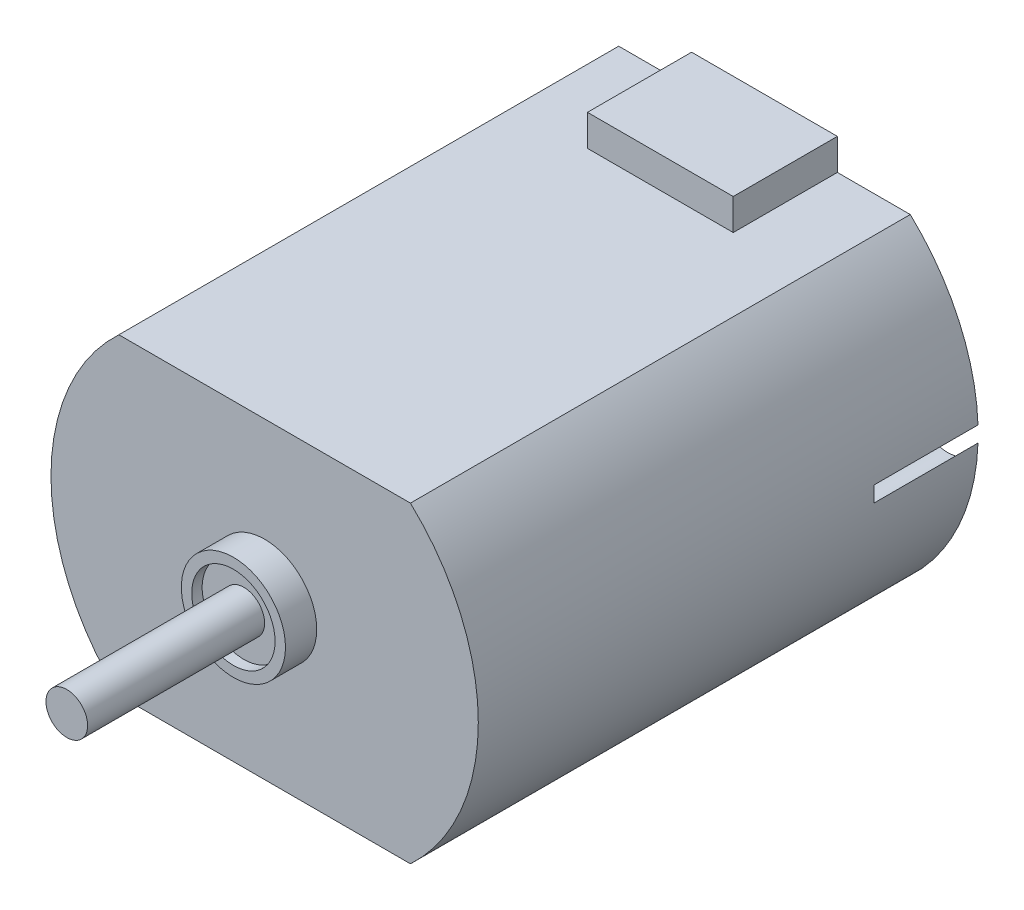
ISO-10303-21;
HEADER;
FILE_DESCRIPTION(('STEP AP214'),'2;1');
FILE_NAME('part.step','',(''),(''),'','','');
FILE_SCHEMA(('AUTOMOTIVE_DESIGN { 1 0 10303 214 1 1 1 1 }'));
ENDSEC;
DATA;
#1=APPLICATION_CONTEXT('core data for automotive mechanical design processes');
#2=APPLICATION_PROTOCOL_DEFINITION('international standard','automotive_design',2000,#1);
#3=PRODUCT_CONTEXT('',#1,'mechanical');
#4=PRODUCT('Part','Part','',(#3));
#5=PRODUCT_RELATED_PRODUCT_CATEGORY('part','',(#4));
#6=PRODUCT_DEFINITION_FORMATION('','',#4);
#7=PRODUCT_DEFINITION_CONTEXT('part definition',#1,'design');
#8=PRODUCT_DEFINITION('design','',#6,#7);
#9=PRODUCT_DEFINITION_SHAPE('','',#8);
#10=(LENGTH_UNIT() NAMED_UNIT(*) SI_UNIT(.MILLI.,.METRE.));
#11=(NAMED_UNIT(*) PLANE_ANGLE_UNIT() SI_UNIT($,.RADIAN.));
#12=(NAMED_UNIT(*) SI_UNIT($,.STERADIAN.) SOLID_ANGLE_UNIT());
#13=UNCERTAINTY_MEASURE_WITH_UNIT(LENGTH_MEASURE(1.E-05),#10,'distance_accuracy_value','');
#14=(GEOMETRIC_REPRESENTATION_CONTEXT(3) GLOBAL_UNCERTAINTY_ASSIGNED_CONTEXT((#13)) GLOBAL_UNIT_ASSIGNED_CONTEXT((#10,
#11,#12)) REPRESENTATION_CONTEXT('',''));
#15=CARTESIAN_POINT('',(0.,0.,0.));
#16=DIRECTION('',(0.,0.,1.));
#17=DIRECTION('',(1.,0.,0.));
#18=AXIS2_PLACEMENT_3D('',#15,#16,#17);
#19=CARTESIAN_POINT('',(-7.,7.5,19.));
#20=DIRECTION('',(0.,-1.,0.));
#21=DIRECTION('',(0.,0.,-1.));
#22=AXIS2_PLACEMENT_3D('',#19,#20,#21);
#23=PLANE('',#22);
#24=DIRECTION('',(0.,0.,-1.));
#25=VECTOR('',#24,1.);
#26=CARTESIAN_POINT('',(3.5,7.5,0.));
#27=LINE('',#26,#25);
#28=CARTESIAN_POINT('',(3.5,7.5,0.));
#29=VERTEX_POINT('',#28);
#30=CARTESIAN_POINT('',(3.5,7.5,-5.));
#31=VERTEX_POINT('',#30);
#32=EDGE_CURVE('E172',#29,#31,#27,.T.);
#33=ORIENTED_EDGE('',*,*,#32,.F.);
#34=DIRECTION('',(-1.,0.,0.));
#35=VECTOR('',#34,1.);
#36=CARTESIAN_POINT('',(3.5,7.5,0.));
#37=LINE('',#36,#35);
#38=CARTESIAN_POINT('',(-3.5,7.5,0.));
#39=VERTEX_POINT('',#38);
#40=EDGE_CURVE('E148',#29,#39,#37,.T.);
#41=ORIENTED_EDGE('',*,*,#40,.T.);
#42=DIRECTION('',(0.,0.,-1.));
#43=VECTOR('',#42,1.);
#44=CARTESIAN_POINT('',(-3.5,7.5,0.));
#45=LINE('',#44,#43);
#46=CARTESIAN_POINT('',(-3.5,7.5,-5.));
#47=VERTEX_POINT('',#46);
#48=EDGE_CURVE('E160',#39,#47,#45,.T.);
#49=ORIENTED_EDGE('',*,*,#48,.T.);
#50=DIRECTION('',(1.,0.,0.));
#51=VECTOR('',#50,1.);
#52=CARTESIAN_POINT('',(7.,7.5,-5.));
#53=LINE('',#52,#51);
#54=CARTESIAN_POINT('',(-7.,7.5,-5.));
#55=VERTEX_POINT('',#54);
#56=EDGE_CURVE('E221',#55,#47,#53,.T.);
#57=ORIENTED_EDGE('',*,*,#56,.F.);
#58=DIRECTION('',(0.,0.,-1.));
#59=VECTOR('',#58,1.);
#60=CARTESIAN_POINT('',(-7.,7.5,19.));
#61=LINE('',#60,#59);
#62=CARTESIAN_POINT('',(-7.,7.5,19.));
#63=VERTEX_POINT('',#62);
#64=EDGE_CURVE('E266',#63,#55,#61,.T.);
#65=ORIENTED_EDGE('',*,*,#64,.F.);
#66=DIRECTION('',(-1.,0.,0.));
#67=VECTOR('',#66,1.);
#68=CARTESIAN_POINT('',(-7.,7.5,19.));
#69=LINE('',#68,#67);
#70=CARTESIAN_POINT('',(7.,7.5,19.));
#71=VERTEX_POINT('',#70);
#72=EDGE_CURVE('E264',#71,#63,#69,.T.);
#73=ORIENTED_EDGE('',*,*,#72,.F.);
#74=DIRECTION('',(0.,0.,-1.));
#75=VECTOR('',#74,1.);
#76=CARTESIAN_POINT('',(7.,7.5,19.));
#77=LINE('',#76,#75);
#78=CARTESIAN_POINT('',(7.,7.5,-5.));
#79=VERTEX_POINT('',#78);
#80=EDGE_CURVE('E272',#71,#79,#77,.T.);
#81=ORIENTED_EDGE('',*,*,#80,.T.);
#82=EDGE_CURVE('E220',#31,#79,#53,.T.);
#83=ORIENTED_EDGE('',*,*,#82,.F.);
#84=EDGE_LOOP('',(#33,#41,#49,#57,#65,#73,#81,#83));
#85=FACE_BOUND('',#84,.T.);
#86=ADVANCED_FACE('F38',(#85),#23,.F.);
#87=CARTESIAN_POINT('',(0.,0.,0.));
#88=DIRECTION('',(0.,0.,1.));
#89=DIRECTION('',(1.,0.,0.));
#90=AXIS2_PLACEMENT_3D('',#87,#88,#89);
#91=PLANE('',#90);
#92=CARTESIAN_POINT('',(-8.8,0.,0.));
#93=DIRECTION('',(0.,0.,1.));
#94=DIRECTION('',(1.,0.,0.));
#95=AXIS2_PLACEMENT_3D('',#92,#93,#94);
#96=CIRCLE('',#95,1.5);
#97=CARTESIAN_POINT('',(-10.2522727272727,-0.375371716595469,0.));
#98=VERTEX_POINT('',#97);
#99=CARTESIAN_POINT('',(-10.2522727272727,0.37537171659547,0.));
#100=VERTEX_POINT('',#99);
#101=EDGE_CURVE('E205',#98,#100,#96,.T.);
#102=ORIENTED_EDGE('',*,*,#101,.F.);
#103=CARTESIAN_POINT('',(0.,0.,0.));
#104=DIRECTION('',(0.,0.,1.));
#105=DIRECTION('',(1.,0.,0.));
#106=AXIS2_PLACEMENT_3D('',#103,#104,#105);
#107=CIRCLE('',#106,10.2591422643416);
#108=EDGE_CURVE('E254',#100,#98,#107,.T.);
#109=ORIENTED_EDGE('',*,*,#108,.F.);
#110=EDGE_LOOP('',(#102,#109));
#111=FACE_BOUND('',#110,.T.);
#112=ADVANCED_FACE('F313',(#111),#91,.F.);
#113=CARTESIAN_POINT('',(8.8,0.,0.));
#114=DIRECTION('',(0.,0.,1.));
#115=DIRECTION('',(-1.,0.,0.));
#116=AXIS2_PLACEMENT_3D('',#113,#114,#115);
#117=CIRCLE('',#116,1.5);
#118=CARTESIAN_POINT('',(10.2522727272727,0.37537171659547,0.));
#119=VERTEX_POINT('',#118);
#120=CARTESIAN_POINT('',(10.2522727272727,-0.375371716595464,0.));
#121=VERTEX_POINT('',#120);
#122=EDGE_CURVE('E200',#119,#121,#117,.T.);
#123=ORIENTED_EDGE('',*,*,#122,.F.);
#124=CARTESIAN_POINT('',(0.,0.,0.));
#125=DIRECTION('',(0.,0.,1.));
#126=DIRECTION('',(1.,0.,0.));
#127=AXIS2_PLACEMENT_3D('',#124,#125,#126);
#128=CIRCLE('',#127,10.2591422643416);
#129=EDGE_CURVE('E260',#121,#119,#128,.T.);
#130=ORIENTED_EDGE('',*,*,#129,.F.);
#131=EDGE_LOOP('',(#123,#130));
#132=FACE_BOUND('',#131,.T.);
#133=ADVANCED_FACE('F311',(#132),#91,.F.);
#134=CARTESIAN_POINT('',(0.,0.,19.));
#135=DIRECTION('',(0.,0.,-1.));
#136=DIRECTION('',(-1.,0.,0.));
#137=AXIS2_PLACEMENT_3D('',#134,#135,#136);
#138=CYLINDRICAL_SURFACE('',#137,10.2591422643416);
#139=ORIENTED_EDGE('',*,*,#64,.T.);
#140=CARTESIAN_POINT('',(0.,0.,-5.));
#141=DIRECTION('',(0.,0.,-1.));
#142=DIRECTION('',(-1.,0.,0.));
#143=AXIS2_PLACEMENT_3D('',#140,#141,#142);
#144=CIRCLE('',#143,10.2591422643416);
#145=CARTESIAN_POINT('',(-10.2522727272727,0.375371716595467,-5.));
#146=VERTEX_POINT('',#145);
#147=EDGE_CURVE('E217',#146,#55,#144,.T.);
#148=ORIENTED_EDGE('',*,*,#147,.F.);
#149=DIRECTION('',(0.,0.,1.));
#150=VECTOR('',#149,1.);
#151=CARTESIAN_POINT('',(-10.2522727272727,0.375371716595467,-5.));
#152=LINE('',#151,#150);
#153=EDGE_CURVE('E224',#146,#100,#152,.T.);
#154=ORIENTED_EDGE('',*,*,#153,.T.);
#155=ORIENTED_EDGE('',*,*,#108,.T.);
#156=DIRECTION('',(0.,0.,1.));
#157=VECTOR('',#156,1.);
#158=CARTESIAN_POINT('',(-10.2522727272727,-0.375371716595465,-5.));
#159=LINE('',#158,#157);
#160=CARTESIAN_POINT('',(-10.2522727272727,-0.375371716595465,-5.));
#161=VERTEX_POINT('',#160);
#162=EDGE_CURVE('E231',#161,#98,#159,.T.);
#163=ORIENTED_EDGE('',*,*,#162,.F.);
#164=CARTESIAN_POINT('',(0.,0.,-5.));
#165=DIRECTION('',(0.,0.,-1.));
#166=DIRECTION('',(-1.,0.,0.));
#167=AXIS2_PLACEMENT_3D('',#164,#165,#166);
#168=CIRCLE('',#167,10.2591422643416);
#169=CARTESIAN_POINT('',(-7.,-7.5,-5.));
#170=VERTEX_POINT('',#169);
#171=EDGE_CURVE('E213',#170,#161,#168,.T.);
#172=ORIENTED_EDGE('',*,*,#171,.F.);
#173=DIRECTION('',(0.,0.,-1.));
#174=VECTOR('',#173,1.);
#175=CARTESIAN_POINT('',(-7.,-7.5,19.));
#176=LINE('',#175,#174);
#177=CARTESIAN_POINT('',(-7.,-7.5,19.));
#178=VERTEX_POINT('',#177);
#179=EDGE_CURVE('E42',#178,#170,#176,.T.);
#180=ORIENTED_EDGE('',*,*,#179,.F.);
#181=CARTESIAN_POINT('',(0.,0.,19.));
#182=DIRECTION('',(0.,0.,1.));
#183=DIRECTION('',(1.,0.,0.));
#184=AXIS2_PLACEMENT_3D('',#181,#182,#183);
#185=CIRCLE('',#184,10.2591422643416);
#186=EDGE_CURVE('E256',#63,#178,#185,.T.);
#187=ORIENTED_EDGE('',*,*,#186,.F.);
#188=EDGE_LOOP('',(#139,#148,#154,#155,#163,#172,#180,#187));
#189=FACE_BOUND('',#188,.T.);
#190=ADVANCED_FACE('F40',(#189),#138,.T.);
#191=CARTESIAN_POINT('',(-7.,-7.5,19.));
#192=DIRECTION('',(0.,1.,0.));
#193=DIRECTION('',(0.,0.,1.));
#194=AXIS2_PLACEMENT_3D('',#191,#192,#193);
#195=PLANE('',#194);
#196=ORIENTED_EDGE('',*,*,#179,.T.);
#197=DIRECTION('',(-1.,0.,0.));
#198=VECTOR('',#197,1.);
#199=CARTESIAN_POINT('',(7.,-7.5,-5.));
#200=LINE('',#199,#198);
#201=CARTESIAN_POINT('',(7.,-7.5,-5.));
#202=VERTEX_POINT('',#201);
#203=EDGE_CURVE('E210',#202,#170,#200,.T.);
#204=ORIENTED_EDGE('',*,*,#203,.F.);
#205=DIRECTION('',(0.,0.,-1.));
#206=VECTOR('',#205,1.);
#207=CARTESIAN_POINT('',(7.,-7.5,19.));
#208=LINE('',#207,#206);
#209=CARTESIAN_POINT('',(7.,-7.5,19.));
#210=VERTEX_POINT('',#209);
#211=EDGE_CURVE('E274',#210,#202,#208,.T.);
#212=ORIENTED_EDGE('',*,*,#211,.F.);
#213=DIRECTION('',(1.,0.,0.));
#214=VECTOR('',#213,1.);
#215=CARTESIAN_POINT('',(-7.,-7.5,19.));
#216=LINE('',#215,#214);
#217=EDGE_CURVE('E259',#178,#210,#216,.T.);
#218=ORIENTED_EDGE('',*,*,#217,.F.);
#219=EDGE_LOOP('',(#196,#204,#212,#218));
#220=FACE_BOUND('',#219,.T.);
#221=ADVANCED_FACE('F282',(#220),#195,.F.);
#222=CARTESIAN_POINT('',(0.,0.,19.));
#223=DIRECTION('',(0.,0.,-1.));
#224=DIRECTION('',(-1.,0.,0.));
#225=AXIS2_PLACEMENT_3D('',#222,#223,#224);
#226=CYLINDRICAL_SURFACE('',#225,10.2591422643416);
#227=ORIENTED_EDGE('',*,*,#211,.T.);
#228=CARTESIAN_POINT('',(0.,0.,-5.));
#229=DIRECTION('',(0.,0.,-1.));
#230=DIRECTION('',(-1.,0.,0.));
#231=AXIS2_PLACEMENT_3D('',#228,#229,#230);
#232=CIRCLE('',#231,10.2591422643416);
#233=CARTESIAN_POINT('',(10.2522727272727,-0.375371716595464,-5.));
#234=VERTEX_POINT('',#233);
#235=EDGE_CURVE('E207',#234,#202,#232,.T.);
#236=ORIENTED_EDGE('',*,*,#235,.F.);
#237=DIRECTION('',(0.,0.,1.));
#238=VECTOR('',#237,1.);
#239=CARTESIAN_POINT('',(10.2522727272727,-0.375371716595464,-5.));
#240=LINE('',#239,#238);
#241=EDGE_CURVE('E234',#234,#121,#240,.T.);
#242=ORIENTED_EDGE('',*,*,#241,.T.);
#243=ORIENTED_EDGE('',*,*,#129,.T.);
#244=DIRECTION('',(0.,0.,1.));
#245=VECTOR('',#244,1.);
#246=CARTESIAN_POINT('',(10.2522727272727,0.375371716595467,-5.));
#247=LINE('',#246,#245);
#248=CARTESIAN_POINT('',(10.2522727272727,0.375371716595467,-5.));
#249=VERTEX_POINT('',#248);
#250=EDGE_CURVE('E237',#249,#119,#247,.T.);
#251=ORIENTED_EDGE('',*,*,#250,.F.);
#252=CARTESIAN_POINT('',(0.,0.,-5.));
#253=DIRECTION('',(0.,0.,-1.));
#254=DIRECTION('',(-1.,0.,0.));
#255=AXIS2_PLACEMENT_3D('',#252,#253,#254);
#256=CIRCLE('',#255,10.2591422643416);
#257=EDGE_CURVE('E201',#79,#249,#256,.T.);
#258=ORIENTED_EDGE('',*,*,#257,.F.);
#259=ORIENTED_EDGE('',*,*,#80,.F.);
#260=CARTESIAN_POINT('',(0.,0.,19.));
#261=DIRECTION('',(0.,0.,1.));
#262=DIRECTION('',(1.,0.,0.));
#263=AXIS2_PLACEMENT_3D('',#260,#261,#262);
#264=CIRCLE('',#263,10.2591422643416);
#265=EDGE_CURVE('E262',#210,#71,#264,.T.);
#266=ORIENTED_EDGE('',*,*,#265,.F.);
#267=EDGE_LOOP('',(#227,#236,#242,#243,#251,#258,#259,#266));
#268=FACE_BOUND('',#267,.T.);
#269=ADVANCED_FACE('F306',(#268),#226,.T.);
#270=CARTESIAN_POINT('',(0.,0.,19.));
#271=DIRECTION('',(0.,0.,1.));
#272=DIRECTION('',(1.,0.,0.));
#273=AXIS2_PLACEMENT_3D('',#270,#271,#272);
#274=PLANE('',#273);
#275=CARTESIAN_POINT('',(0.,0.,19.));
#276=DIRECTION('',(0.,0.,1.));
#277=DIRECTION('',(1.,0.,0.));
#278=AXIS2_PLACEMENT_3D('',#275,#276,#277);
#279=CIRCLE('',#278,2.5);
#280=CARTESIAN_POINT('',(2.5,0.,19.));
#281=VERTEX_POINT('',#280);
#282=EDGE_CURVE('E11',#281,#281,#279,.T.);
#283=ORIENTED_EDGE('',*,*,#282,.F.);
#284=EDGE_LOOP('',(#283));
#285=FACE_BOUND('',#284,.T.);
#286=ORIENTED_EDGE('',*,*,#186,.T.);
#287=ORIENTED_EDGE('',*,*,#217,.T.);
#288=ORIENTED_EDGE('',*,*,#265,.T.);
#289=ORIENTED_EDGE('',*,*,#72,.T.);
#290=EDGE_LOOP('',(#286,#287,#288,#289));
#291=FACE_BOUND('',#290,.T.);
#292=ADVANCED_FACE('F327',(#285,#291),#274,.T.);
#293=CARTESIAN_POINT('',(0.,0.,20.5));
#294=DIRECTION('',(0.,0.,-1.));
#295=DIRECTION('',(-1.,0.,0.));
#296=AXIS2_PLACEMENT_3D('',#293,#294,#295);
#297=CYLINDRICAL_SURFACE('',#296,2.5);
#298=CARTESIAN_POINT('',(0.,0.,20.5));
#299=DIRECTION('',(0.,0.,1.));
#300=DIRECTION('',(1.,0.,0.));
#301=AXIS2_PLACEMENT_3D('',#298,#299,#300);
#302=CIRCLE('',#301,2.5);
#303=CARTESIAN_POINT('',(2.5,0.,20.5));
#304=VERTEX_POINT('',#303);
#305=EDGE_CURVE('E250',#304,#304,#302,.T.);
#306=ORIENTED_EDGE('',*,*,#305,.F.);
#307=EDGE_LOOP('',(#306));
#308=FACE_BOUND('',#307,.T.);
#309=ORIENTED_EDGE('',*,*,#282,.T.);
#310=EDGE_LOOP('',(#309));
#311=FACE_BOUND('',#310,.T.);
#312=ADVANCED_FACE('F344',(#308,#311),#297,.T.);
#313=CARTESIAN_POINT('',(0.,0.,20.5));
#314=DIRECTION('',(0.,0.,1.));
#315=DIRECTION('',(1.,0.,0.));
#316=AXIS2_PLACEMENT_3D('',#313,#314,#315);
#317=PLANE('',#316);
#318=CARTESIAN_POINT('',(0.,0.,20.5));
#319=DIRECTION('',(0.,0.,1.));
#320=DIRECTION('',(1.,0.,0.));
#321=AXIS2_PLACEMENT_3D('',#318,#319,#320);
#322=CIRCLE('',#321,2.);
#323=CARTESIAN_POINT('',(2.,0.,20.5));
#324=VERTEX_POINT('',#323);
#325=EDGE_CURVE('E244',#324,#324,#322,.T.);
#326=ORIENTED_EDGE('',*,*,#325,.F.);
#327=EDGE_LOOP('',(#326));
#328=FACE_BOUND('',#327,.T.);
#329=ORIENTED_EDGE('',*,*,#305,.T.);
#330=EDGE_LOOP('',(#329));
#331=FACE_BOUND('',#330,.T.);
#332=ADVANCED_FACE('F351',(#328,#331),#317,.T.);
#333=CARTESIAN_POINT('',(0.,0.,20.));
#334=DIRECTION('',(0.,0.,1.));
#335=DIRECTION('',(1.,0.,0.));
#336=AXIS2_PLACEMENT_3D('',#333,#334,#335);
#337=CYLINDRICAL_SURFACE('',#336,2.);
#338=CARTESIAN_POINT('',(0.,0.,20.));
#339=DIRECTION('',(0.,0.,1.));
#340=DIRECTION('',(1.,0.,0.));
#341=AXIS2_PLACEMENT_3D('',#338,#339,#340);
#342=CIRCLE('',#341,2.);
#343=CARTESIAN_POINT('',(2.,0.,20.));
#344=VERTEX_POINT('',#343);
#345=EDGE_CURVE('E247',#344,#344,#342,.T.);
#346=ORIENTED_EDGE('',*,*,#345,.F.);
#347=EDGE_LOOP('',(#346));
#348=FACE_BOUND('',#347,.T.);
#349=ORIENTED_EDGE('',*,*,#325,.T.);
#350=EDGE_LOOP('',(#349));
#351=FACE_BOUND('',#350,.T.);
#352=ADVANCED_FACE('F359',(#348,#351),#337,.F.);
#353=CARTESIAN_POINT('',(0.,0.,20.));
#354=DIRECTION('',(0.,0.,1.));
#355=DIRECTION('',(1.,0.,0.));
#356=AXIS2_PLACEMENT_3D('',#353,#354,#355);
#357=PLANE('',#356);
#358=CARTESIAN_POINT('',(0.,0.,20.));
#359=DIRECTION('',(0.,0.,1.));
#360=DIRECTION('',(1.,0.,0.));
#361=AXIS2_PLACEMENT_3D('',#358,#359,#360);
#362=CIRCLE('',#361,1.);
#363=CARTESIAN_POINT('',(1.,0.,20.));
#364=VERTEX_POINT('',#363);
#365=EDGE_CURVE('E240',#364,#364,#362,.T.);
#366=ORIENTED_EDGE('',*,*,#365,.F.);
#367=EDGE_LOOP('',(#366));
#368=FACE_BOUND('',#367,.T.);
#369=ORIENTED_EDGE('',*,*,#345,.T.);
#370=EDGE_LOOP('',(#369));
#371=FACE_BOUND('',#370,.T.);
#372=ADVANCED_FACE('F367',(#368,#371),#357,.T.);
#373=CARTESIAN_POINT('',(0.,0.,28.5));
#374=DIRECTION('',(0.,0.,-1.));
#375=DIRECTION('',(-1.,0.,0.));
#376=AXIS2_PLACEMENT_3D('',#373,#374,#375);
#377=CYLINDRICAL_SURFACE('',#376,1.);
#378=CARTESIAN_POINT('',(0.,0.,28.5));
#379=DIRECTION('',(0.,0.,1.));
#380=DIRECTION('',(1.,0.,0.));
#381=AXIS2_PLACEMENT_3D('',#378,#379,#380);
#382=CIRCLE('',#381,1.);
#383=CARTESIAN_POINT('',(1.,0.,28.5));
#384=VERTEX_POINT('',#383);
#385=EDGE_CURVE('E241',#384,#384,#382,.T.);
#386=ORIENTED_EDGE('',*,*,#385,.F.);
#387=EDGE_LOOP('',(#386));
#388=FACE_BOUND('',#387,.T.);
#389=ORIENTED_EDGE('',*,*,#365,.T.);
#390=EDGE_LOOP('',(#389));
#391=FACE_BOUND('',#390,.T.);
#392=ADVANCED_FACE('F375',(#388,#391),#377,.T.);
#393=CARTESIAN_POINT('',(0.,0.,28.5));
#394=DIRECTION('',(0.,0.,1.));
#395=DIRECTION('',(1.,0.,0.));
#396=AXIS2_PLACEMENT_3D('',#393,#394,#395);
#397=PLANE('',#396);
#398=ORIENTED_EDGE('',*,*,#385,.T.);
#399=EDGE_LOOP('',(#398));
#400=FACE_BOUND('',#399,.T.);
#401=ADVANCED_FACE('F383',(#400),#397,.T.);
#402=CARTESIAN_POINT('',(8.8,0.,-5.));
#403=DIRECTION('',(0.,0.,1.));
#404=DIRECTION('',(1.,0.,0.));
#405=AXIS2_PLACEMENT_3D('',#402,#403,#404);
#406=CYLINDRICAL_SURFACE('',#405,1.5);
#407=ORIENTED_EDGE('',*,*,#122,.T.);
#408=ORIENTED_EDGE('',*,*,#241,.F.);
#409=CARTESIAN_POINT('',(8.8,0.,-5.));
#410=DIRECTION('',(0.,0.,1.));
#411=DIRECTION('',(-1.,0.,0.));
#412=AXIS2_PLACEMENT_3D('',#409,#410,#411);
#413=CIRCLE('',#412,1.5);
#414=EDGE_CURVE('E204',#249,#234,#413,.T.);
#415=ORIENTED_EDGE('',*,*,#414,.F.);
#416=ORIENTED_EDGE('',*,*,#250,.T.);
#417=EDGE_LOOP('',(#407,#408,#415,#416));
#418=FACE_BOUND('',#417,.T.);
#419=ADVANCED_FACE('F308',(#418),#406,.F.);
#420=CARTESIAN_POINT('',(-8.8,0.,-5.));
#421=DIRECTION('',(0.,0.,1.));
#422=DIRECTION('',(1.,0.,0.));
#423=AXIS2_PLACEMENT_3D('',#420,#421,#422);
#424=CYLINDRICAL_SURFACE('',#423,1.5);
#425=ORIENTED_EDGE('',*,*,#101,.T.);
#426=ORIENTED_EDGE('',*,*,#153,.F.);
#427=CARTESIAN_POINT('',(-8.8,0.,-5.));
#428=DIRECTION('',(0.,0.,1.));
#429=DIRECTION('',(1.,0.,0.));
#430=AXIS2_PLACEMENT_3D('',#427,#428,#429);
#431=CIRCLE('',#430,1.5);
#432=EDGE_CURVE('E215',#161,#146,#431,.T.);
#433=ORIENTED_EDGE('',*,*,#432,.F.);
#434=ORIENTED_EDGE('',*,*,#162,.T.);
#435=EDGE_LOOP('',(#425,#426,#433,#434));
#436=FACE_BOUND('',#435,.T.);
#437=ADVANCED_FACE('F292',(#436),#424,.F.);
#438=CARTESIAN_POINT('',(0.,0.,-5.));
#439=DIRECTION('',(0.,0.,-1.));
#440=DIRECTION('',(-1.,0.,0.));
#441=AXIS2_PLACEMENT_3D('',#438,#439,#440);
#442=PLANE('',#441);
#443=CARTESIAN_POINT('',(0.,0.,-5.));
#444=DIRECTION('',(0.,0.,-1.));
#445=DIRECTION('',(-1.,0.,0.));
#446=AXIS2_PLACEMENT_3D('',#443,#444,#445);
#447=CIRCLE('',#446,4.5);
#448=CARTESIAN_POINT('',(-3.,-3.35410196624968,-5.));
#449=VERTEX_POINT('',#448);
#450=CARTESIAN_POINT('',(3.,-3.35410196624968,-5.));
#451=VERTEX_POINT('',#450);
#452=EDGE_CURVE('E184',#449,#451,#447,.T.);
#453=ORIENTED_EDGE('',*,*,#452,.F.);
#454=DIRECTION('',(-1.,0.,0.));
#455=VECTOR('',#454,1.);
#456=CARTESIAN_POINT('',(3.,-3.35410196624968,-5.));
#457=LINE('',#456,#455);
#458=EDGE_CURVE('E61',#451,#449,#457,.T.);
#459=ORIENTED_EDGE('',*,*,#458,.F.);
#460=EDGE_LOOP('',(#453,#459));
#461=FACE_BOUND('',#460,.T.);
#462=ORIENTED_EDGE('',*,*,#257,.T.);
#463=ORIENTED_EDGE('',*,*,#414,.T.);
#464=ORIENTED_EDGE('',*,*,#235,.T.);
#465=ORIENTED_EDGE('',*,*,#203,.T.);
#466=ORIENTED_EDGE('',*,*,#171,.T.);
#467=ORIENTED_EDGE('',*,*,#432,.T.);
#468=ORIENTED_EDGE('',*,*,#147,.T.);
#469=ORIENTED_EDGE('',*,*,#56,.T.);
#470=DIRECTION('',(0.,1.,0.));
#471=VECTOR('',#470,1.);
#472=CARTESIAN_POINT('',(-3.5,9.,-5.));
#473=LINE('',#472,#471);
#474=CARTESIAN_POINT('',(-3.5,9.,-5.));
#475=VERTEX_POINT('',#474);
#476=EDGE_CURVE('E54',#47,#475,#473,.T.);
#477=ORIENTED_EDGE('',*,*,#476,.T.);
#478=DIRECTION('',(1.,0.,0.));
#479=VECTOR('',#478,1.);
#480=CARTESIAN_POINT('',(3.5,9.,-5.));
#481=LINE('',#480,#479);
#482=CARTESIAN_POINT('',(3.5,9.,-5.));
#483=VERTEX_POINT('',#482);
#484=EDGE_CURVE('E145',#475,#483,#481,.T.);
#485=ORIENTED_EDGE('',*,*,#484,.T.);
#486=DIRECTION('',(0.,-1.,0.));
#487=VECTOR('',#486,1.);
#488=CARTESIAN_POINT('',(3.5,7.5,-5.));
#489=LINE('',#488,#487);
#490=EDGE_CURVE('E161',#483,#31,#489,.T.);
#491=ORIENTED_EDGE('',*,*,#490,.T.);
#492=ORIENTED_EDGE('',*,*,#82,.T.);
#493=EDGE_LOOP('',(#462,#463,#464,#465,#466,#467,#468,#469,#477,#485,#491,#492));
#494=FACE_BOUND('',#493,.T.);
#495=ADVANCED_FACE('F287',(#461,#494),#442,.T.);
#496=CARTESIAN_POINT('',(0.,0.,-7.));
#497=DIRECTION('',(0.,0.,1.));
#498=DIRECTION('',(1.,0.,0.));
#499=AXIS2_PLACEMENT_3D('',#496,#497,#498);
#500=CYLINDRICAL_SURFACE('',#499,4.5);
#501=ORIENTED_EDGE('',*,*,#452,.T.);
#502=DIRECTION('',(0.,0.,1.));
#503=VECTOR('',#502,1.);
#504=CARTESIAN_POINT('',(3.,-3.35410196624968,-7.));
#505=LINE('',#504,#503);
#506=CARTESIAN_POINT('',(3.,-3.35410196624968,-7.));
#507=VERTEX_POINT('',#506);
#508=EDGE_CURVE('E198',#507,#451,#505,.T.);
#509=ORIENTED_EDGE('',*,*,#508,.F.);
#510=CARTESIAN_POINT('',(0.,0.,-7.));
#511=DIRECTION('',(0.,0.,-1.));
#512=DIRECTION('',(-1.,0.,0.));
#513=AXIS2_PLACEMENT_3D('',#510,#511,#512);
#514=CIRCLE('',#513,4.5);
#515=CARTESIAN_POINT('',(-3.,-3.35410196624968,-7.));
#516=VERTEX_POINT('',#515);
#517=EDGE_CURVE('E187',#516,#507,#514,.T.);
#518=ORIENTED_EDGE('',*,*,#517,.F.);
#519=DIRECTION('',(0.,0.,1.));
#520=VECTOR('',#519,1.);
#521=CARTESIAN_POINT('',(-3.,-3.35410196624968,-7.));
#522=LINE('',#521,#520);
#523=EDGE_CURVE('E192',#516,#449,#522,.T.);
#524=ORIENTED_EDGE('',*,*,#523,.T.);
#525=EDGE_LOOP('',(#501,#509,#518,#524));
#526=FACE_BOUND('',#525,.T.);
#527=ADVANCED_FACE('F411',(#526),#500,.T.);
#528=CARTESIAN_POINT('',(3.,-3.35410196624968,-7.));
#529=DIRECTION('',(0.,1.,0.));
#530=DIRECTION('',(0.,0.,1.));
#531=AXIS2_PLACEMENT_3D('',#528,#529,#530);
#532=PLANE('',#531);
#533=ORIENTED_EDGE('',*,*,#458,.T.);
#534=ORIENTED_EDGE('',*,*,#523,.F.);
#535=DIRECTION('',(-1.,0.,0.));
#536=VECTOR('',#535,1.);
#537=CARTESIAN_POINT('',(3.,-3.35410196624968,-7.));
#538=LINE('',#537,#536);
#539=EDGE_CURVE('E190',#507,#516,#538,.T.);
#540=ORIENTED_EDGE('',*,*,#539,.F.);
#541=ORIENTED_EDGE('',*,*,#508,.T.);
#542=EDGE_LOOP('',(#533,#534,#540,#541));
#543=FACE_BOUND('',#542,.T.);
#544=ADVANCED_FACE('F418',(#543),#532,.F.);
#545=CARTESIAN_POINT('',(0.,0.,-7.));
#546=DIRECTION('',(0.,0.,-1.));
#547=DIRECTION('',(-1.,0.,0.));
#548=AXIS2_PLACEMENT_3D('',#545,#546,#547);
#549=PLANE('',#548);
#550=CARTESIAN_POINT('',(0.,0.,-7.));
#551=DIRECTION('',(0.,0.,-1.));
#552=DIRECTION('',(-1.,0.,0.));
#553=AXIS2_PLACEMENT_3D('',#550,#551,#552);
#554=CIRCLE('',#553,2.);
#555=CARTESIAN_POINT('',(-2.,0.,-7.));
#556=VERTEX_POINT('',#555);
#557=EDGE_CURVE('E178',#556,#556,#554,.T.);
#558=ORIENTED_EDGE('',*,*,#557,.F.);
#559=EDGE_LOOP('',(#558));
#560=FACE_BOUND('',#559,.T.);
#561=ORIENTED_EDGE('',*,*,#517,.T.);
#562=ORIENTED_EDGE('',*,*,#539,.T.);
#563=EDGE_LOOP('',(#561,#562));
#564=FACE_BOUND('',#563,.T.);
#565=ADVANCED_FACE('F426',(#560,#564),#549,.T.);
#566=CARTESIAN_POINT('',(0.,0.,-6.99));
#567=DIRECTION('',(0.,0.,-1.));
#568=DIRECTION('',(-1.,0.,0.));
#569=AXIS2_PLACEMENT_3D('',#566,#567,#568);
#570=CYLINDRICAL_SURFACE('',#569,2.);
#571=CARTESIAN_POINT('',(0.,0.,-6.99));
#572=DIRECTION('',(0.,0.,-1.));
#573=DIRECTION('',(-1.,0.,0.));
#574=AXIS2_PLACEMENT_3D('',#571,#572,#573);
#575=CIRCLE('',#574,2.);
#576=CARTESIAN_POINT('',(-2.,0.,-6.99));
#577=VERTEX_POINT('',#576);
#578=EDGE_CURVE('E181',#577,#577,#575,.T.);
#579=CARTESIAN_POINT('',(-2.,0.,-6.99));
#580=CARTESIAN_POINT('',(-2.,0.,-6.99010416666667));
#581=CARTESIAN_POINT('',(-2.,0.,-6.99020833333333));
#582=CARTESIAN_POINT('',(-2.,0.,-6.99041666666667));
#583=CARTESIAN_POINT('',(-2.,0.,-6.99052083333333));
#584=CARTESIAN_POINT('',(-2.,0.,-6.99072916666667));
#585=CARTESIAN_POINT('',(-2.,0.,-6.99083333333333));
#586=CARTESIAN_POINT('',(-2.,0.,-6.99104166666667));
#587=CARTESIAN_POINT('',(-2.,0.,-6.99114583333333));
#588=CARTESIAN_POINT('',(-2.,0.,-6.99135416666667));
#589=CARTESIAN_POINT('',(-2.,0.,-6.99145833333333));
#590=CARTESIAN_POINT('',(-2.,0.,-6.99166666666667));
#591=CARTESIAN_POINT('',(-2.,0.,-6.99177083333333));
#592=CARTESIAN_POINT('',(-2.,0.,-6.99197916666667));
#593=CARTESIAN_POINT('',(-2.,0.,-6.99208333333333));
#594=CARTESIAN_POINT('',(-2.,0.,-6.99229166666667));
#595=CARTESIAN_POINT('',(-2.,0.,-6.99239583333333));
#596=CARTESIAN_POINT('',(-2.,0.,-6.99260416666667));
#597=CARTESIAN_POINT('',(-2.,0.,-6.99270833333333));
#598=CARTESIAN_POINT('',(-2.,0.,-6.99291666666667));
#599=CARTESIAN_POINT('',(-2.,0.,-6.99302083333333));
#600=CARTESIAN_POINT('',(-2.,0.,-6.99322916666667));
#601=CARTESIAN_POINT('',(-2.,0.,-6.99333333333333));
#602=CARTESIAN_POINT('',(-2.,0.,-6.99354166666667));
#603=CARTESIAN_POINT('',(-2.,0.,-6.99364583333333));
#604=CARTESIAN_POINT('',(-2.,0.,-6.99385416666667));
#605=CARTESIAN_POINT('',(-2.,0.,-6.99395833333333));
#606=CARTESIAN_POINT('',(-2.,0.,-6.99416666666667));
#607=CARTESIAN_POINT('',(-2.,0.,-6.99427083333333));
#608=CARTESIAN_POINT('',(-2.,0.,-6.99447916666667));
#609=CARTESIAN_POINT('',(-2.,0.,-6.99458333333333));
#610=CARTESIAN_POINT('',(-2.,0.,-6.99479166666667));
#611=CARTESIAN_POINT('',(-2.,0.,-6.99489583333333));
#612=CARTESIAN_POINT('',(-2.,0.,-6.99510416666667));
#613=CARTESIAN_POINT('',(-2.,0.,-6.99520833333333));
#614=CARTESIAN_POINT('',(-2.,0.,-6.99541666666667));
#615=CARTESIAN_POINT('',(-2.,0.,-6.99552083333333));
#616=CARTESIAN_POINT('',(-2.,0.,-6.99572916666667));
#617=CARTESIAN_POINT('',(-2.,0.,-6.99583333333333));
#618=CARTESIAN_POINT('',(-2.,0.,-6.99604166666667));
#619=CARTESIAN_POINT('',(-2.,0.,-6.99614583333333));
#620=CARTESIAN_POINT('',(-2.,0.,-6.99635416666667));
#621=CARTESIAN_POINT('',(-2.,0.,-6.99645833333333));
#622=CARTESIAN_POINT('',(-2.,0.,-6.99666666666667));
#623=CARTESIAN_POINT('',(-2.,0.,-6.99677083333333));
#624=CARTESIAN_POINT('',(-2.,0.,-6.99697916666667));
#625=CARTESIAN_POINT('',(-2.,0.,-6.99708333333333));
#626=CARTESIAN_POINT('',(-2.,0.,-6.99729166666667));
#627=CARTESIAN_POINT('',(-2.,0.,-6.99739583333333));
#628=CARTESIAN_POINT('',(-2.,0.,-6.99760416666667));
#629=CARTESIAN_POINT('',(-2.,0.,-6.99770833333333));
#630=CARTESIAN_POINT('',(-2.,0.,-6.99791666666667));
#631=CARTESIAN_POINT('',(-2.,0.,-6.99802083333333));
#632=CARTESIAN_POINT('',(-2.,0.,-6.99822916666667));
#633=CARTESIAN_POINT('',(-2.,0.,-6.99833333333333));
#634=CARTESIAN_POINT('',(-2.,0.,-6.99854166666667));
#635=CARTESIAN_POINT('',(-2.,0.,-6.99864583333333));
#636=CARTESIAN_POINT('',(-2.,0.,-6.99885416666667));
#637=CARTESIAN_POINT('',(-2.,0.,-6.99895833333333));
#638=CARTESIAN_POINT('',(-2.,0.,-6.99916666666667));
#639=CARTESIAN_POINT('',(-2.,0.,-6.99927083333333));
#640=CARTESIAN_POINT('',(-2.,0.,-6.99947916666667));
#641=CARTESIAN_POINT('',(-2.,0.,-6.99958333333333));
#642=CARTESIAN_POINT('',(-2.,0.,-6.99979166666667));
#643=CARTESIAN_POINT('',(-2.,0.,-6.99989583333333));
#644=CARTESIAN_POINT('',(-2.,0.,-7.));
#645=B_SPLINE_CURVE_WITH_KNOTS('',3,(#579,#580,#581,#582,#583,#584,#585,#586,#587,#588,#589,
#590,#591,#592,#593,#594,#595,#596,#597,#598,#599,#600,#601,#602,#603,#604,#605,#606,#607,#608,
#609,#610,#611,#612,#613,#614,#615,#616,#617,#618,#619,#620,#621,#622,#623,#624,#625,#626,#627,
#628,#629,#630,#631,#632,#633,#634,#635,#636,#637,#638,#639,#640,#641,#642,#643,#644),
.UNSPECIFIED.,.F.,.F.,(4,2,2,2,2,2,2,2,2,2,2,2,2,2,2,2,2,2,2,2,2,2,2,2,2,2,2,2,2,2,2,2,4),(0.,
0.000312500000000313,0.000625000000000625,0.00093750000000007,0.00125000000000038,
0.0015625000000007,0.00187500000000014,0.00218750000000045,0.00250000000000077,
0.00281250000000021,0.00312500000000052,0.00343749999999997,0.00375000000000028,
0.00406250000000059,0.00437500000000004,0.00468750000000035,0.00500000000000066,
0.00531250000000011,0.00562500000000042,0.00593749999999987,0.00625000000000018,
0.00656250000000049,0.00687499999999994,0.00718750000000025,0.00750000000000056,
0.00781250000000001,0.00812500000000032,0.00843749999999976,0.00875000000000008,
0.00906250000000039,0.00937499999999983,0.00968750000000015,0.0100000000000005),.UNSPECIFIED.);
#646=EDGE_CURVE('BSEAM434',#577,#556,#645,.T.);
#647=ORIENTED_EDGE('',*,*,#578,.F.);
#648=ORIENTED_EDGE('',*,*,#557,.T.);
#649=ORIENTED_EDGE('',*,*,#646,.T.);
#650=ORIENTED_EDGE('',*,*,#646,.F.);
#651=EDGE_LOOP('',(#647,#649,#648,#650));
#652=FACE_BOUND('',#651,.T.);
#653=ADVANCED_FACE('F434',(#652),#570,.F.);
#654=CARTESIAN_POINT('',(0.,0.,-6.99));
#655=DIRECTION('',(0.,0.,-1.));
#656=DIRECTION('',(-1.,0.,0.));
#657=AXIS2_PLACEMENT_3D('',#654,#655,#656);
#658=PLANE('',#657);
#659=CARTESIAN_POINT('',(0.,0.,-6.99));
#660=DIRECTION('',(0.,0.,-1.));
#661=DIRECTION('',(-1.,0.,0.));
#662=AXIS2_PLACEMENT_3D('',#659,#660,#661);
#663=CIRCLE('',#662,1.);
#664=CARTESIAN_POINT('',(-1.,0.,-6.99));
#665=VERTEX_POINT('',#664);
#666=EDGE_CURVE('E171',#665,#665,#663,.T.);
#667=ORIENTED_EDGE('',*,*,#666,.F.);
#668=EDGE_LOOP('',(#667));
#669=FACE_BOUND('',#668,.T.);
#670=ORIENTED_EDGE('',*,*,#578,.T.);
#671=EDGE_LOOP('',(#670));
#672=FACE_BOUND('',#671,.T.);
#673=ADVANCED_FACE('F442',(#669,#672),#658,.T.);
#674=CARTESIAN_POINT('',(0.,0.,-7.89));
#675=DIRECTION('',(0.,0.,1.));
#676=DIRECTION('',(1.,0.,0.));
#677=AXIS2_PLACEMENT_3D('',#674,#675,#676);
#678=CYLINDRICAL_SURFACE('',#677,1.);
#679=CARTESIAN_POINT('',(0.,0.,-7.89));
#680=DIRECTION('',(0.,0.,-1.));
#681=DIRECTION('',(-1.,0.,0.));
#682=AXIS2_PLACEMENT_3D('',#679,#680,#681);
#683=CIRCLE('',#682,1.);
#684=CARTESIAN_POINT('',(-1.,0.,-7.89));
#685=VERTEX_POINT('',#684);
#686=EDGE_CURVE('E175',#685,#685,#683,.T.);
#687=ORIENTED_EDGE('',*,*,#686,.F.);
#688=EDGE_LOOP('',(#687));
#689=FACE_BOUND('',#688,.T.);
#690=ORIENTED_EDGE('',*,*,#666,.T.);
#691=EDGE_LOOP('',(#690));
#692=FACE_BOUND('',#691,.T.);
#693=ADVANCED_FACE('F450',(#689,#692),#678,.T.);
#694=CARTESIAN_POINT('',(0.,0.,-7.89));
#695=DIRECTION('',(0.,0.,-1.));
#696=DIRECTION('',(-1.,0.,0.));
#697=AXIS2_PLACEMENT_3D('',#694,#695,#696);
#698=PLANE('',#697);
#699=ORIENTED_EDGE('',*,*,#686,.T.);
#700=EDGE_LOOP('',(#699));
#701=FACE_BOUND('',#700,.T.);
#702=ADVANCED_FACE('F458',(#701),#698,.T.);
#703=CARTESIAN_POINT('',(-3.5,9.,0.));
#704=DIRECTION('',(-1.,0.,0.));
#705=DIRECTION('',(0.,0.,1.));
#706=AXIS2_PLACEMENT_3D('',#703,#704,#705);
#707=PLANE('',#706);
#708=ORIENTED_EDGE('',*,*,#476,.F.);
#709=ORIENTED_EDGE('',*,*,#48,.F.);
#710=DIRECTION('',(0.,1.,0.));
#711=VECTOR('',#710,1.);
#712=CARTESIAN_POINT('',(-3.5,9.,0.));
#713=LINE('',#712,#711);
#714=CARTESIAN_POINT('',(-3.5,9.,0.));
#715=VERTEX_POINT('',#714);
#716=EDGE_CURVE('E155',#39,#715,#713,.T.);
#717=ORIENTED_EDGE('',*,*,#716,.T.);
#718=DIRECTION('',(0.,0.,-1.));
#719=VECTOR('',#718,1.);
#720=CARTESIAN_POINT('',(-3.5,9.,0.));
#721=LINE('',#720,#719);
#722=EDGE_CURVE('E140',#715,#475,#721,.T.);
#723=ORIENTED_EDGE('',*,*,#722,.T.);
#724=EDGE_LOOP('',(#708,#709,#717,#723));
#725=FACE_BOUND('',#724,.T.);
#726=ADVANCED_FACE('F159',(#725),#707,.T.);
#727=CARTESIAN_POINT('',(3.5,7.5,0.));
#728=DIRECTION('',(1.,0.,0.));
#729=DIRECTION('',(0.,0.,-1.));
#730=AXIS2_PLACEMENT_3D('',#727,#728,#729);
#731=PLANE('',#730);
#732=ORIENTED_EDGE('',*,*,#490,.F.);
#733=DIRECTION('',(0.,0.,-1.));
#734=VECTOR('',#733,1.);
#735=CARTESIAN_POINT('',(3.5,9.,0.));
#736=LINE('',#735,#734);
#737=CARTESIAN_POINT('',(3.5,9.,0.));
#738=VERTEX_POINT('',#737);
#739=EDGE_CURVE('E147',#738,#483,#736,.T.);
#740=ORIENTED_EDGE('',*,*,#739,.F.);
#741=DIRECTION('',(0.,-1.,0.));
#742=VECTOR('',#741,1.);
#743=CARTESIAN_POINT('',(3.5,7.5,0.));
#744=LINE('',#743,#742);
#745=EDGE_CURVE('E157',#738,#29,#744,.T.);
#746=ORIENTED_EDGE('',*,*,#745,.T.);
#747=ORIENTED_EDGE('',*,*,#32,.T.);
#748=EDGE_LOOP('',(#732,#740,#746,#747));
#749=FACE_BOUND('',#748,.T.);
#750=ADVANCED_FACE('F302',(#749),#731,.T.);
#751=CARTESIAN_POINT('',(3.5,9.,0.));
#752=DIRECTION('',(0.,1.,0.));
#753=DIRECTION('',(0.,0.,1.));
#754=AXIS2_PLACEMENT_3D('',#751,#752,#753);
#755=PLANE('',#754);
#756=ORIENTED_EDGE('',*,*,#484,.F.);
#757=ORIENTED_EDGE('',*,*,#722,.F.);
#758=DIRECTION('',(1.,0.,0.));
#759=VECTOR('',#758,1.);
#760=CARTESIAN_POINT('',(3.5,9.,0.));
#761=LINE('',#760,#759);
#762=EDGE_CURVE('E143',#715,#738,#761,.T.);
#763=ORIENTED_EDGE('',*,*,#762,.T.);
#764=ORIENTED_EDGE('',*,*,#739,.T.);
#765=EDGE_LOOP('',(#756,#757,#763,#764));
#766=FACE_BOUND('',#765,.T.);
#767=ADVANCED_FACE('F142',(#766),#755,.T.);
#768=CARTESIAN_POINT('',(0.,0.,0.));
#769=DIRECTION('',(0.,0.,-1.));
#770=DIRECTION('',(-1.,0.,0.));
#771=AXIS2_PLACEMENT_3D('',#768,#769,#770);
#772=PLANE('',#771);
#773=ORIENTED_EDGE('',*,*,#716,.F.);
#774=ORIENTED_EDGE('',*,*,#40,.F.);
#775=ORIENTED_EDGE('',*,*,#745,.F.);
#776=ORIENTED_EDGE('',*,*,#762,.F.);
#777=EDGE_LOOP('',(#773,#774,#775,#776));
#778=FACE_BOUND('',#777,.T.);
#779=ADVANCED_FACE('F153',(#778),#772,.F.);
#780=CLOSED_SHELL('',(#86,#112,#133,#190,#221,#269,#292,#312,#332,#352,#372,#392,#401,#419,#437,
#495,#527,#544,#565,#653,#673,#693,#702,#726,#750,#767,#779));
#781=MANIFOLD_SOLID_BREP('B2',#780);
#782=ADVANCED_BREP_SHAPE_REPRESENTATION('',(#18,#781),#14);
#783=SHAPE_DEFINITION_REPRESENTATION(#9,#782);
ENDSEC;
END-ISO-10303-21;
